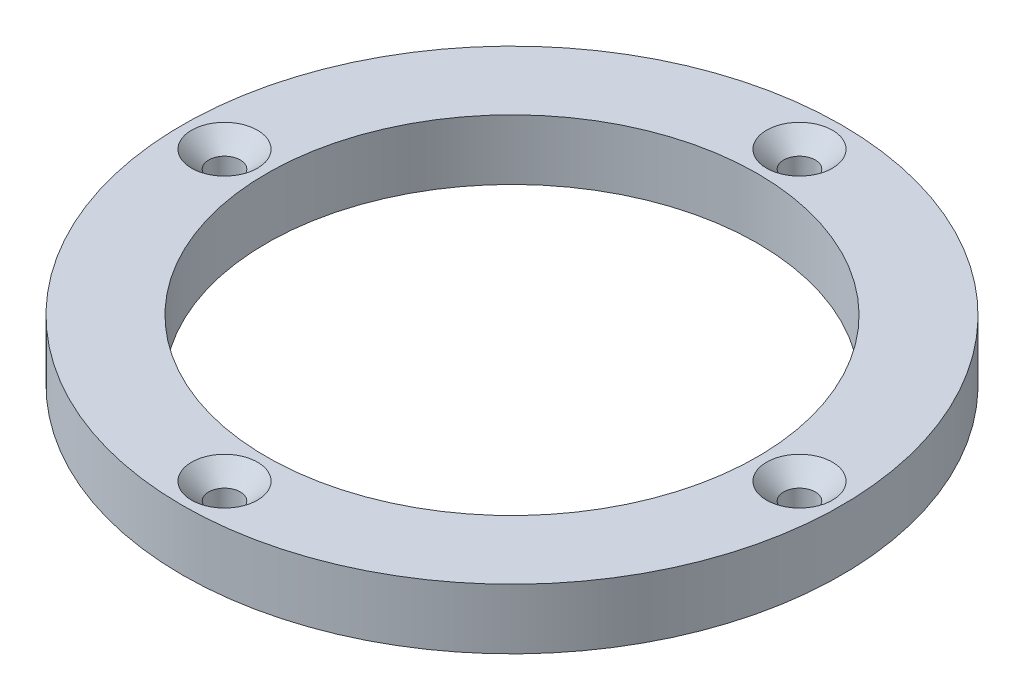
ISO-10303-21;
HEADER;
FILE_DESCRIPTION(('STEP AP214'),'2;1');
FILE_NAME('part.step','',(''),(''),'','','');
FILE_SCHEMA(('AUTOMOTIVE_DESIGN { 1 0 10303 214 1 1 1 1 }'));
ENDSEC;
DATA;
#1=APPLICATION_CONTEXT('core data for automotive mechanical design processes');
#2=APPLICATION_PROTOCOL_DEFINITION('international standard','automotive_design',2000,#1);
#3=PRODUCT_CONTEXT('',#1,'mechanical');
#4=PRODUCT('Part','Part','',(#3));
#5=PRODUCT_RELATED_PRODUCT_CATEGORY('part','',(#4));
#6=PRODUCT_DEFINITION_FORMATION('','',#4);
#7=PRODUCT_DEFINITION_CONTEXT('part definition',#1,'design');
#8=PRODUCT_DEFINITION('design','',#6,#7);
#9=PRODUCT_DEFINITION_SHAPE('','',#8);
#10=(LENGTH_UNIT() NAMED_UNIT(*) SI_UNIT(.MILLI.,.METRE.));
#11=(NAMED_UNIT(*) PLANE_ANGLE_UNIT() SI_UNIT($,.RADIAN.));
#12=(NAMED_UNIT(*) SI_UNIT($,.STERADIAN.) SOLID_ANGLE_UNIT());
#13=UNCERTAINTY_MEASURE_WITH_UNIT(LENGTH_MEASURE(1.E-05),#10,'distance_accuracy_value','');
#14=(GEOMETRIC_REPRESENTATION_CONTEXT(3) GLOBAL_UNCERTAINTY_ASSIGNED_CONTEXT((#13)) GLOBAL_UNIT_ASSIGNED_CONTEXT((#10,
#11,#12)) REPRESENTATION_CONTEXT('',''));
#15=CARTESIAN_POINT('',(0.,0.,0.));
#16=DIRECTION('',(0.,0.,1.));
#17=DIRECTION('',(1.,0.,0.));
#18=AXIS2_PLACEMENT_3D('',#15,#16,#17);
#19=CARTESIAN_POINT('',(0.,8.6,0.));
#20=DIRECTION('',(0.,1.,0.));
#21=DIRECTION('',(0.,0.,1.));
#22=AXIS2_PLACEMENT_3D('',#19,#20,#21);
#23=PLANE('',#22);
#24=CARTESIAN_POINT('',(0.,8.6,-41.));
#25=DIRECTION('',(0.,1.,0.));
#26=DIRECTION('',(0.,0.,1.));
#27=AXIS2_PLACEMENT_3D('',#24,#25,#26);
#28=CIRCLE('',#27,4.7);
#29=CARTESIAN_POINT('',(0.,8.6,-36.3));
#30=VERTEX_POINT('',#29);
#31=EDGE_CURVE('E88',#30,#30,#28,.T.);
#32=ORIENTED_EDGE('',*,*,#31,.F.);
#33=EDGE_LOOP('',(#32));
#34=FACE_BOUND('',#33,.T.);
#35=CARTESIAN_POINT('',(0.,8.6,41.));
#36=DIRECTION('',(0.,1.,0.));
#37=DIRECTION('',(0.,0.,1.));
#38=AXIS2_PLACEMENT_3D('',#35,#36,#37);
#39=CIRCLE('',#38,4.7);
#40=CARTESIAN_POINT('',(0.,8.6,45.7));
#41=VERTEX_POINT('',#40);
#42=EDGE_CURVE('E80',#41,#41,#39,.T.);
#43=ORIENTED_EDGE('',*,*,#42,.F.);
#44=EDGE_LOOP('',(#43));
#45=FACE_BOUND('',#44,.T.);
#46=CARTESIAN_POINT('',(-41.,8.6,0.));
#47=DIRECTION('',(0.,1.,0.));
#48=DIRECTION('',(0.,0.,1.));
#49=AXIS2_PLACEMENT_3D('',#46,#47,#48);
#50=CIRCLE('',#49,4.7);
#51=CARTESIAN_POINT('',(-41.,8.6,4.7));
#52=VERTEX_POINT('',#51);
#53=EDGE_CURVE('E68',#52,#52,#50,.T.);
#54=ORIENTED_EDGE('',*,*,#53,.F.);
#55=EDGE_LOOP('',(#54));
#56=FACE_BOUND('',#55,.T.);
#57=CARTESIAN_POINT('',(41.,8.6,0.));
#58=DIRECTION('',(0.,1.,0.));
#59=DIRECTION('',(0.,0.,1.));
#60=AXIS2_PLACEMENT_3D('',#57,#58,#59);
#61=CIRCLE('',#60,4.7);
#62=CARTESIAN_POINT('',(41.,8.6,4.7));
#63=VERTEX_POINT('',#62);
#64=EDGE_CURVE('E63',#63,#63,#61,.T.);
#65=ORIENTED_EDGE('',*,*,#64,.F.);
#66=EDGE_LOOP('',(#65));
#67=FACE_BOUND('',#66,.T.);
#68=CARTESIAN_POINT('',(0.,8.6,0.));
#69=DIRECTION('',(0.,1.,0.));
#70=DIRECTION('',(0.,0.,1.));
#71=AXIS2_PLACEMENT_3D('',#68,#69,#70);
#72=CIRCLE('',#71,47.);
#73=CARTESIAN_POINT('',(0.,8.6,-47.));
#74=VERTEX_POINT('',#73);
#75=EDGE_CURVE('E10',#74,#74,#72,.T.);
#76=ORIENTED_EDGE('',*,*,#75,.T.);
#77=EDGE_LOOP('',(#76));
#78=FACE_BOUND('',#77,.T.);
#79=CARTESIAN_POINT('',(0.,8.6,0.));
#80=DIRECTION('',(0.,1.,0.));
#81=DIRECTION('',(0.,0.,1.));
#82=AXIS2_PLACEMENT_3D('',#79,#80,#81);
#83=CIRCLE('',#82,35.);
#84=CARTESIAN_POINT('',(0.,8.6,-35.));
#85=VERTEX_POINT('',#84);
#86=EDGE_CURVE('E48',#85,#85,#83,.T.);
#87=ORIENTED_EDGE('',*,*,#86,.F.);
#88=EDGE_LOOP('',(#87));
#89=FACE_BOUND('',#88,.T.);
#90=ADVANCED_FACE('F40',(#34,#45,#56,#67,#78,#89),#23,.T.);
#91=CARTESIAN_POINT('',(0.,0.,0.));
#92=DIRECTION('',(0.,1.,0.));
#93=DIRECTION('',(0.,0.,1.));
#94=AXIS2_PLACEMENT_3D('',#91,#92,#93);
#95=PLANE('',#94);
#96=CARTESIAN_POINT('',(0.,0.,-41.));
#97=DIRECTION('',(0.,1.,0.));
#98=DIRECTION('',(0.,0.,1.));
#99=AXIS2_PLACEMENT_3D('',#96,#97,#98);
#100=CIRCLE('',#99,2.25);
#101=CARTESIAN_POINT('',(0.,0.,-38.75));
#102=VERTEX_POINT('',#101);
#103=EDGE_CURVE('E85',#102,#102,#100,.T.);
#104=ORIENTED_EDGE('',*,*,#103,.T.);
#105=EDGE_LOOP('',(#104));
#106=FACE_BOUND('',#105,.T.);
#107=CARTESIAN_POINT('',(0.,0.,41.));
#108=DIRECTION('',(0.,1.,0.));
#109=DIRECTION('',(0.,0.,1.));
#110=AXIS2_PLACEMENT_3D('',#107,#108,#109);
#111=CIRCLE('',#110,2.25);
#112=CARTESIAN_POINT('',(0.,0.,43.25));
#113=VERTEX_POINT('',#112);
#114=EDGE_CURVE('E71',#113,#113,#111,.T.);
#115=ORIENTED_EDGE('',*,*,#114,.T.);
#116=EDGE_LOOP('',(#115));
#117=FACE_BOUND('',#116,.T.);
#118=CARTESIAN_POINT('',(-41.,0.,0.));
#119=DIRECTION('',(0.,1.,0.));
#120=DIRECTION('',(0.,0.,1.));
#121=AXIS2_PLACEMENT_3D('',#118,#119,#120);
#122=CIRCLE('',#121,2.25);
#123=CARTESIAN_POINT('',(-41.,0.,2.25));
#124=VERTEX_POINT('',#123);
#125=EDGE_CURVE('E62',#124,#124,#122,.T.);
#126=ORIENTED_EDGE('',*,*,#125,.T.);
#127=EDGE_LOOP('',(#126));
#128=FACE_BOUND('',#127,.T.);
#129=CARTESIAN_POINT('',(41.,0.,0.));
#130=DIRECTION('',(0.,1.,0.));
#131=DIRECTION('',(0.,0.,1.));
#132=AXIS2_PLACEMENT_3D('',#129,#130,#131);
#133=CIRCLE('',#132,2.25);
#134=CARTESIAN_POINT('',(41.,0.,2.25));
#135=VERTEX_POINT('',#134);
#136=EDGE_CURVE('E52',#135,#135,#133,.T.);
#137=ORIENTED_EDGE('',*,*,#136,.T.);
#138=EDGE_LOOP('',(#137));
#139=FACE_BOUND('',#138,.T.);
#140=CARTESIAN_POINT('',(0.,0.,0.));
#141=DIRECTION('',(0.,1.,0.));
#142=DIRECTION('',(0.,0.,1.));
#143=AXIS2_PLACEMENT_3D('',#140,#141,#142);
#144=CIRCLE('',#143,47.);
#145=CARTESIAN_POINT('',(0.,0.,-47.));
#146=VERTEX_POINT('',#145);
#147=EDGE_CURVE('E41',#146,#146,#144,.T.);
#148=ORIENTED_EDGE('',*,*,#147,.F.);
#149=EDGE_LOOP('',(#148));
#150=FACE_BOUND('',#149,.T.);
#151=CARTESIAN_POINT('',(0.,0.,0.));
#152=DIRECTION('',(0.,1.,0.));
#153=DIRECTION('',(0.,0.,1.));
#154=AXIS2_PLACEMENT_3D('',#151,#152,#153);
#155=CIRCLE('',#154,35.);
#156=CARTESIAN_POINT('',(0.,0.,-35.));
#157=VERTEX_POINT('',#156);
#158=EDGE_CURVE('E49',#157,#157,#155,.T.);
#159=ORIENTED_EDGE('',*,*,#158,.T.);
#160=EDGE_LOOP('',(#159));
#161=FACE_BOUND('',#160,.T.);
#162=ADVANCED_FACE('F96',(#106,#117,#128,#139,#150,#161),#95,.F.);
#163=CARTESIAN_POINT('',(0.,8.6,0.));
#164=DIRECTION('',(0.,-1.,0.));
#165=DIRECTION('',(0.,0.,-1.));
#166=AXIS2_PLACEMENT_3D('',#163,#164,#165);
#167=CYLINDRICAL_SURFACE('',#166,47.);
#168=CARTESIAN_POINT('',(0.,8.6,-47.));
#169=CARTESIAN_POINT('',(0.,8.51041666666667,-47.));
#170=CARTESIAN_POINT('',(0.,8.42083333333333,-47.));
#171=CARTESIAN_POINT('',(0.,8.24166666666667,-47.));
#172=CARTESIAN_POINT('',(0.,8.15208333333333,-47.));
#173=CARTESIAN_POINT('',(0.,7.97291666666666,-47.));
#174=CARTESIAN_POINT('',(0.,7.88333333333333,-47.));
#175=CARTESIAN_POINT('',(0.,7.70416666666667,-47.));
#176=CARTESIAN_POINT('',(0.,7.61458333333333,-47.));
#177=CARTESIAN_POINT('',(0.,7.43541666666667,-47.));
#178=CARTESIAN_POINT('',(0.,7.34583333333333,-47.));
#179=CARTESIAN_POINT('',(0.,7.16666666666667,-47.));
#180=CARTESIAN_POINT('',(0.,7.07708333333333,-47.));
#181=CARTESIAN_POINT('',(0.,6.89791666666667,-47.));
#182=CARTESIAN_POINT('',(0.,6.80833333333333,-47.));
#183=CARTESIAN_POINT('',(0.,6.62916666666667,-47.));
#184=CARTESIAN_POINT('',(0.,6.53958333333333,-47.));
#185=CARTESIAN_POINT('',(0.,6.36041666666667,-47.));
#186=CARTESIAN_POINT('',(0.,6.27083333333333,-47.));
#187=CARTESIAN_POINT('',(0.,6.09166666666667,-47.));
#188=CARTESIAN_POINT('',(0.,6.00208333333333,-47.));
#189=CARTESIAN_POINT('',(0.,5.82291666666666,-47.));
#190=CARTESIAN_POINT('',(0.,5.73333333333333,-47.));
#191=CARTESIAN_POINT('',(0.,5.55416666666666,-47.));
#192=CARTESIAN_POINT('',(0.,5.46458333333333,-47.));
#193=CARTESIAN_POINT('',(0.,5.28541666666666,-47.));
#194=CARTESIAN_POINT('',(0.,5.19583333333333,-47.));
#195=CARTESIAN_POINT('',(0.,5.01666666666666,-47.));
#196=CARTESIAN_POINT('',(0.,4.92708333333333,-47.));
#197=CARTESIAN_POINT('',(0.,4.74791666666667,-47.));
#198=CARTESIAN_POINT('',(0.,4.65833333333333,-47.));
#199=CARTESIAN_POINT('',(0.,4.47916666666667,-47.));
#200=CARTESIAN_POINT('',(0.,4.38958333333333,-47.));
#201=CARTESIAN_POINT('',(0.,4.21041666666667,-47.));
#202=CARTESIAN_POINT('',(0.,4.12083333333333,-47.));
#203=CARTESIAN_POINT('',(0.,3.94166666666667,-47.));
#204=CARTESIAN_POINT('',(0.,3.85208333333333,-47.));
#205=CARTESIAN_POINT('',(0.,3.67291666666666,-47.));
#206=CARTESIAN_POINT('',(0.,3.58333333333333,-47.));
#207=CARTESIAN_POINT('',(0.,3.40416666666666,-47.));
#208=CARTESIAN_POINT('',(0.,3.31458333333333,-47.));
#209=CARTESIAN_POINT('',(0.,3.13541666666666,-47.));
#210=CARTESIAN_POINT('',(0.,3.04583333333333,-47.));
#211=CARTESIAN_POINT('',(0.,2.86666666666666,-47.));
#212=CARTESIAN_POINT('',(0.,2.77708333333333,-47.));
#213=CARTESIAN_POINT('',(0.,2.59791666666666,-47.));
#214=CARTESIAN_POINT('',(0.,2.50833333333333,-47.));
#215=CARTESIAN_POINT('',(0.,2.32916666666666,-47.));
#216=CARTESIAN_POINT('',(0.,2.23958333333333,-47.));
#217=CARTESIAN_POINT('',(0.,2.06041666666666,-47.));
#218=CARTESIAN_POINT('',(0.,1.97083333333333,-47.));
#219=CARTESIAN_POINT('',(0.,1.79166666666666,-47.));
#220=CARTESIAN_POINT('',(0.,1.70208333333333,-47.));
#221=CARTESIAN_POINT('',(0.,1.52291666666666,-47.));
#222=CARTESIAN_POINT('',(0.,1.43333333333333,-47.));
#223=CARTESIAN_POINT('',(0.,1.25416666666666,-47.));
#224=CARTESIAN_POINT('',(0.,1.16458333333333,-47.));
#225=CARTESIAN_POINT('',(0.,0.985416666666664,-47.));
#226=CARTESIAN_POINT('',(0.,0.89583333333333,-47.));
#227=CARTESIAN_POINT('',(0.,0.716666666666664,-47.));
#228=CARTESIAN_POINT('',(0.,0.627083333333331,-47.));
#229=CARTESIAN_POINT('',(0.,0.447916666666665,-47.));
#230=CARTESIAN_POINT('',(0.,0.358333333333331,-47.));
#231=CARTESIAN_POINT('',(0.,0.179166666666665,-47.));
#232=CARTESIAN_POINT('',(0.,0.0895833333333316,-47.));
#233=CARTESIAN_POINT('',(0.,0.,-47.));
#234=B_SPLINE_CURVE_WITH_KNOTS('',3,(#168,#169,#170,#171,#172,#173,#174,#175,#176,#177,#178,
#179,#180,#181,#182,#183,#184,#185,#186,#187,#188,#189,#190,#191,#192,#193,#194,#195,#196,#197,
#198,#199,#200,#201,#202,#203,#204,#205,#206,#207,#208,#209,#210,#211,#212,#213,#214,#215,#216,
#217,#218,#219,#220,#221,#222,#223,#224,#225,#226,#227,#228,#229,#230,#231,#232,#233),
.UNSPECIFIED.,.F.,.F.,(4,2,2,2,2,2,2,2,2,2,2,2,2,2,2,2,2,2,2,2,2,2,2,2,2,2,2,2,2,2,2,2,4),(0.,
0.268750000000002,0.537500000000002,0.806250000000001,1.075,1.34375,1.6125,1.88125,2.15,2.41875,
2.6875,2.95625,3.225,3.49375,3.7625,4.03125,4.3,4.56875,4.8375,5.10625,5.375,5.64375,5.9125,
6.18125,6.45,6.71875,6.9875,7.25625,7.525,7.79375,8.0625,8.33125,8.6),.UNSPECIFIED.);
#235=EDGE_CURVE('BSEAM39',#74,#146,#234,.T.);
#236=ORIENTED_EDGE('',*,*,#75,.F.);
#237=ORIENTED_EDGE('',*,*,#147,.T.);
#238=ORIENTED_EDGE('',*,*,#235,.T.);
#239=ORIENTED_EDGE('',*,*,#235,.F.);
#240=EDGE_LOOP('',(#236,#238,#237,#239));
#241=FACE_BOUND('',#240,.T.);
#242=ADVANCED_FACE('F39',(#241),#167,.T.);
#243=CARTESIAN_POINT('',(0.,8.6,0.));
#244=DIRECTION('',(0.,-1.,0.));
#245=DIRECTION('',(0.,0.,-1.));
#246=AXIS2_PLACEMENT_3D('',#243,#244,#245);
#247=CYLINDRICAL_SURFACE('',#246,35.);
#248=CARTESIAN_POINT('',(0.,8.6,-35.));
#249=CARTESIAN_POINT('',(0.,8.51041666666666,-35.));
#250=CARTESIAN_POINT('',(0.,8.42083333333333,-35.));
#251=CARTESIAN_POINT('',(0.,8.24166666666667,-35.));
#252=CARTESIAN_POINT('',(0.,8.15208333333333,-35.));
#253=CARTESIAN_POINT('',(0.,7.97291666666667,-35.));
#254=CARTESIAN_POINT('',(0.,7.88333333333333,-35.));
#255=CARTESIAN_POINT('',(0.,7.70416666666667,-35.));
#256=CARTESIAN_POINT('',(0.,7.61458333333333,-35.));
#257=CARTESIAN_POINT('',(0.,7.43541666666667,-35.));
#258=CARTESIAN_POINT('',(0.,7.34583333333333,-35.));
#259=CARTESIAN_POINT('',(0.,7.16666666666667,-35.));
#260=CARTESIAN_POINT('',(0.,7.07708333333333,-35.));
#261=CARTESIAN_POINT('',(0.,6.89791666666667,-35.));
#262=CARTESIAN_POINT('',(0.,6.80833333333333,-35.));
#263=CARTESIAN_POINT('',(0.,6.62916666666667,-35.));
#264=CARTESIAN_POINT('',(0.,6.53958333333333,-35.));
#265=CARTESIAN_POINT('',(0.,6.36041666666667,-35.));
#266=CARTESIAN_POINT('',(0.,6.27083333333333,-35.));
#267=CARTESIAN_POINT('',(0.,6.09166666666667,-35.));
#268=CARTESIAN_POINT('',(0.,6.00208333333333,-35.));
#269=CARTESIAN_POINT('',(0.,5.82291666666667,-35.));
#270=CARTESIAN_POINT('',(0.,5.73333333333333,-35.));
#271=CARTESIAN_POINT('',(0.,5.55416666666667,-35.));
#272=CARTESIAN_POINT('',(0.,5.46458333333333,-35.));
#273=CARTESIAN_POINT('',(0.,5.28541666666667,-35.));
#274=CARTESIAN_POINT('',(0.,5.19583333333333,-35.));
#275=CARTESIAN_POINT('',(0.,5.01666666666667,-35.));
#276=CARTESIAN_POINT('',(0.,4.92708333333333,-35.));
#277=CARTESIAN_POINT('',(0.,4.74791666666667,-35.));
#278=CARTESIAN_POINT('',(0.,4.65833333333333,-35.));
#279=CARTESIAN_POINT('',(0.,4.47916666666667,-35.));
#280=CARTESIAN_POINT('',(0.,4.38958333333333,-35.));
#281=CARTESIAN_POINT('',(0.,4.21041666666667,-35.));
#282=CARTESIAN_POINT('',(0.,4.12083333333333,-35.));
#283=CARTESIAN_POINT('',(0.,3.94166666666667,-35.));
#284=CARTESIAN_POINT('',(0.,3.85208333333333,-35.));
#285=CARTESIAN_POINT('',(0.,3.67291666666667,-35.));
#286=CARTESIAN_POINT('',(0.,3.58333333333333,-35.));
#287=CARTESIAN_POINT('',(0.,3.40416666666667,-35.));
#288=CARTESIAN_POINT('',(0.,3.31458333333333,-35.));
#289=CARTESIAN_POINT('',(0.,3.13541666666667,-35.));
#290=CARTESIAN_POINT('',(0.,3.04583333333333,-35.));
#291=CARTESIAN_POINT('',(0.,2.86666666666667,-35.));
#292=CARTESIAN_POINT('',(0.,2.77708333333333,-35.));
#293=CARTESIAN_POINT('',(0.,2.59791666666667,-35.));
#294=CARTESIAN_POINT('',(0.,2.50833333333333,-35.));
#295=CARTESIAN_POINT('',(0.,2.32916666666667,-35.));
#296=CARTESIAN_POINT('',(0.,2.23958333333333,-35.));
#297=CARTESIAN_POINT('',(0.,2.06041666666667,-35.));
#298=CARTESIAN_POINT('',(0.,1.97083333333333,-35.));
#299=CARTESIAN_POINT('',(0.,1.79166666666667,-35.));
#300=CARTESIAN_POINT('',(0.,1.70208333333333,-35.));
#301=CARTESIAN_POINT('',(0.,1.52291666666667,-35.));
#302=CARTESIAN_POINT('',(0.,1.43333333333333,-35.));
#303=CARTESIAN_POINT('',(0.,1.25416666666667,-35.));
#304=CARTESIAN_POINT('',(0.,1.16458333333333,-35.));
#305=CARTESIAN_POINT('',(0.,0.985416666666665,-35.));
#306=CARTESIAN_POINT('',(0.,0.895833333333332,-35.));
#307=CARTESIAN_POINT('',(0.,0.716666666666665,-35.));
#308=CARTESIAN_POINT('',(0.,0.627083333333332,-35.));
#309=CARTESIAN_POINT('',(0.,0.447916666666665,-35.));
#310=CARTESIAN_POINT('',(0.,0.358333333333331,-35.));
#311=CARTESIAN_POINT('',(0.,0.179166666666665,-35.));
#312=CARTESIAN_POINT('',(0.,0.0895833333333315,-35.));
#313=CARTESIAN_POINT('',(0.,0.,-35.));
#314=B_SPLINE_CURVE_WITH_KNOTS('',3,(#248,#249,#250,#251,#252,#253,#254,#255,#256,#257,#258,
#259,#260,#261,#262,#263,#264,#265,#266,#267,#268,#269,#270,#271,#272,#273,#274,#275,#276,#277,
#278,#279,#280,#281,#282,#283,#284,#285,#286,#287,#288,#289,#290,#291,#292,#293,#294,#295,#296,
#297,#298,#299,#300,#301,#302,#303,#304,#305,#306,#307,#308,#309,#310,#311,#312,#313),
.UNSPECIFIED.,.F.,.F.,(4,2,2,2,2,2,2,2,2,2,2,2,2,2,2,2,2,2,2,2,2,2,2,2,2,2,2,2,2,2,2,2,4),(0.,
0.26875,0.5375,0.806249999999999,1.075,1.34375,1.6125,1.88125,2.15,2.41875,2.6875,2.95625,3.225,
3.49375,3.7625,4.03125,4.3,4.56875,4.8375,5.10625,5.375,5.64375,5.9125,6.18125,6.45,6.71875,
6.9875,7.25625,7.525,7.79375,8.0625,8.33125,8.6),.UNSPECIFIED.);
#315=EDGE_CURVE('BSEAM108',#85,#157,#314,.T.);
#316=ORIENTED_EDGE('',*,*,#86,.T.);
#317=ORIENTED_EDGE('',*,*,#158,.F.);
#318=ORIENTED_EDGE('',*,*,#315,.T.);
#319=ORIENTED_EDGE('',*,*,#315,.F.);
#320=EDGE_LOOP('',(#316,#318,#317,#319));
#321=FACE_BOUND('',#320,.T.);
#322=ADVANCED_FACE('F108',(#321),#247,.F.);
#323=CARTESIAN_POINT('',(41.,8.6,0.));
#324=DIRECTION('',(0.,1.,0.));
#325=DIRECTION('',(0.,0.,1.));
#326=AXIS2_PLACEMENT_3D('',#323,#324,#325);
#327=CYLINDRICAL_SURFACE('',#326,2.25);
#328=ORIENTED_EDGE('',*,*,#136,.F.);
#329=EDGE_LOOP('',(#328));
#330=FACE_BOUND('',#329,.T.);
#331=CARTESIAN_POINT('',(41.,6.15,0.));
#332=DIRECTION('',(0.,1.,0.));
#333=DIRECTION('',(0.,0.,1.));
#334=AXIS2_PLACEMENT_3D('',#331,#332,#333);
#335=CIRCLE('',#334,2.25);
#336=CARTESIAN_POINT('',(41.,6.15,2.25));
#337=VERTEX_POINT('',#336);
#338=EDGE_CURVE('E59',#337,#337,#335,.T.);
#339=ORIENTED_EDGE('',*,*,#338,.T.);
#340=EDGE_LOOP('',(#339));
#341=FACE_BOUND('',#340,.T.);
#342=ADVANCED_FACE('F107',(#330,#341),#327,.F.);
#343=CARTESIAN_POINT('',(41.,8.6,0.));
#344=DIRECTION('',(0.,1.,0.));
#345=DIRECTION('',(0.,0.,1.));
#346=AXIS2_PLACEMENT_3D('',#343,#344,#345);
#347=CONICAL_SURFACE('',#346,4.7,0.785398163397447);
#348=ORIENTED_EDGE('',*,*,#338,.F.);
#349=EDGE_LOOP('',(#348));
#350=FACE_BOUND('',#349,.T.);
#351=ORIENTED_EDGE('',*,*,#64,.T.);
#352=EDGE_LOOP('',(#351));
#353=FACE_BOUND('',#352,.T.);
#354=ADVANCED_FACE('F121',(#350,#353),#347,.F.);
#355=CARTESIAN_POINT('',(-41.,8.6,0.));
#356=DIRECTION('',(0.,1.,0.));
#357=DIRECTION('',(0.,0.,1.));
#358=AXIS2_PLACEMENT_3D('',#355,#356,#357);
#359=CYLINDRICAL_SURFACE('',#358,2.25);
#360=ORIENTED_EDGE('',*,*,#125,.F.);
#361=EDGE_LOOP('',(#360));
#362=FACE_BOUND('',#361,.T.);
#363=CARTESIAN_POINT('',(-41.,6.15,0.));
#364=DIRECTION('',(0.,1.,0.));
#365=DIRECTION('',(0.,0.,1.));
#366=AXIS2_PLACEMENT_3D('',#363,#364,#365);
#367=CIRCLE('',#366,2.25);
#368=CARTESIAN_POINT('',(-41.,6.15,2.25));
#369=VERTEX_POINT('',#368);
#370=EDGE_CURVE('E70',#369,#369,#367,.T.);
#371=ORIENTED_EDGE('',*,*,#370,.T.);
#372=EDGE_LOOP('',(#371));
#373=FACE_BOUND('',#372,.T.);
#374=ADVANCED_FACE('F130',(#362,#373),#359,.F.);
#375=CARTESIAN_POINT('',(-41.,8.6,0.));
#376=DIRECTION('',(0.,1.,0.));
#377=DIRECTION('',(0.,0.,1.));
#378=AXIS2_PLACEMENT_3D('',#375,#376,#377);
#379=CONICAL_SURFACE('',#378,4.7,0.785398163397447);
#380=ORIENTED_EDGE('',*,*,#370,.F.);
#381=EDGE_LOOP('',(#380));
#382=FACE_BOUND('',#381,.T.);
#383=ORIENTED_EDGE('',*,*,#53,.T.);
#384=EDGE_LOOP('',(#383));
#385=FACE_BOUND('',#384,.T.);
#386=ADVANCED_FACE('F131',(#382,#385),#379,.F.);
#387=CARTESIAN_POINT('',(0.,8.6,41.));
#388=DIRECTION('',(0.,1.,0.));
#389=DIRECTION('',(0.,0.,1.));
#390=AXIS2_PLACEMENT_3D('',#387,#388,#389);
#391=CYLINDRICAL_SURFACE('',#390,2.25);
#392=ORIENTED_EDGE('',*,*,#114,.F.);
#393=EDGE_LOOP('',(#392));
#394=FACE_BOUND('',#393,.T.);
#395=CARTESIAN_POINT('',(0.,6.15,41.));
#396=DIRECTION('',(0.,1.,0.));
#397=DIRECTION('',(0.,0.,1.));
#398=AXIS2_PLACEMENT_3D('',#395,#396,#397);
#399=CIRCLE('',#398,2.25);
#400=CARTESIAN_POINT('',(0.,6.15,43.25));
#401=VERTEX_POINT('',#400);
#402=EDGE_CURVE('E78',#401,#401,#399,.T.);
#403=ORIENTED_EDGE('',*,*,#402,.T.);
#404=EDGE_LOOP('',(#403));
#405=FACE_BOUND('',#404,.T.);
#406=ADVANCED_FACE('F134',(#394,#405),#391,.F.);
#407=CARTESIAN_POINT('',(0.,8.6,41.));
#408=DIRECTION('',(0.,1.,0.));
#409=DIRECTION('',(0.,0.,1.));
#410=AXIS2_PLACEMENT_3D('',#407,#408,#409);
#411=CONICAL_SURFACE('',#410,4.7,0.785398163397448);
#412=ORIENTED_EDGE('',*,*,#402,.F.);
#413=EDGE_LOOP('',(#412));
#414=FACE_BOUND('',#413,.T.);
#415=ORIENTED_EDGE('',*,*,#42,.T.);
#416=EDGE_LOOP('',(#415));
#417=FACE_BOUND('',#416,.T.);
#418=ADVANCED_FACE('F137',(#414,#417),#411,.F.);
#419=CARTESIAN_POINT('',(0.,8.6,-41.));
#420=DIRECTION('',(0.,1.,0.));
#421=DIRECTION('',(0.,0.,1.));
#422=AXIS2_PLACEMENT_3D('',#419,#420,#421);
#423=CYLINDRICAL_SURFACE('',#422,2.25);
#424=ORIENTED_EDGE('',*,*,#103,.F.);
#425=EDGE_LOOP('',(#424));
#426=FACE_BOUND('',#425,.T.);
#427=CARTESIAN_POINT('',(0.,6.15,-41.));
#428=DIRECTION('',(0.,1.,0.));
#429=DIRECTION('',(0.,0.,1.));
#430=AXIS2_PLACEMENT_3D('',#427,#428,#429);
#431=CIRCLE('',#430,2.25);
#432=CARTESIAN_POINT('',(0.,6.15,-38.75));
#433=VERTEX_POINT('',#432);
#434=EDGE_CURVE('E82',#433,#433,#431,.T.);
#435=ORIENTED_EDGE('',*,*,#434,.T.);
#436=EDGE_LOOP('',(#435));
#437=FACE_BOUND('',#436,.T.);
#438=ADVANCED_FACE('F142',(#426,#437),#423,.F.);
#439=CARTESIAN_POINT('',(0.,8.6,-41.));
#440=DIRECTION('',(0.,1.,0.));
#441=DIRECTION('',(0.,0.,1.));
#442=AXIS2_PLACEMENT_3D('',#439,#440,#441);
#443=CONICAL_SURFACE('',#442,4.7,0.785398163397448);
#444=ORIENTED_EDGE('',*,*,#434,.F.);
#445=EDGE_LOOP('',(#444));
#446=FACE_BOUND('',#445,.T.);
#447=ORIENTED_EDGE('',*,*,#31,.T.);
#448=EDGE_LOOP('',(#447));
#449=FACE_BOUND('',#448,.T.);
#450=ADVANCED_FACE('F95',(#446,#449),#443,.F.);
#451=CLOSED_SHELL('',(#90,#162,#242,#322,#342,#354,#374,#386,#406,#418,#438,#450));
#452=MANIFOLD_SOLID_BREP('B2',#451);
#453=ADVANCED_BREP_SHAPE_REPRESENTATION('',(#18,#452),#14);
#454=SHAPE_DEFINITION_REPRESENTATION(#9,#453);
ENDSEC;
END-ISO-10303-21;
